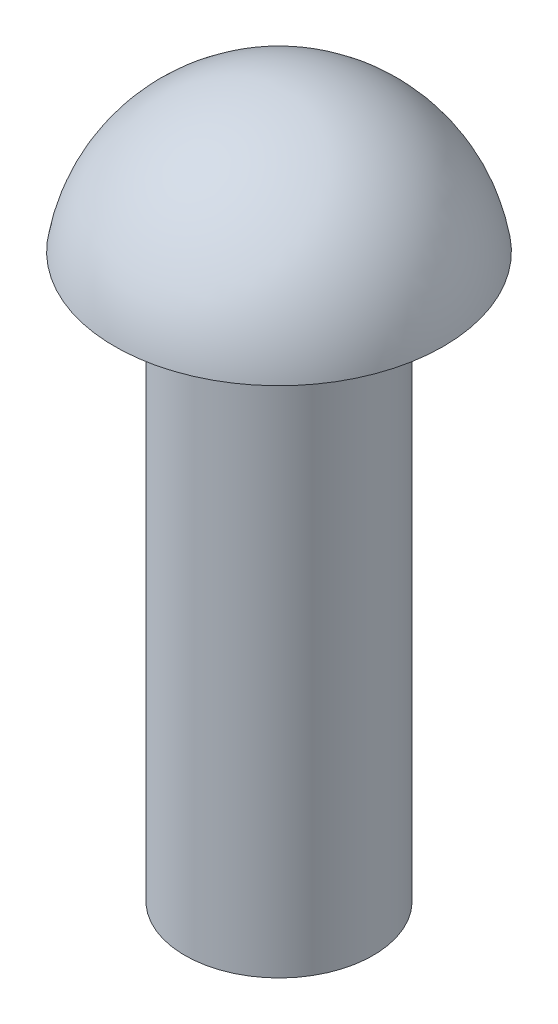
ISO-10303-21;
HEADER;
FILE_DESCRIPTION(('STEP AP214'),'2;1');
FILE_NAME('part.step','',(''),(''),'','','');
FILE_SCHEMA(('AUTOMOTIVE_DESIGN { 1 0 10303 214 1 1 1 1 }'));
ENDSEC;
DATA;
#1=APPLICATION_CONTEXT('core data for automotive mechanical design processes');
#2=APPLICATION_PROTOCOL_DEFINITION('international standard','automotive_design',2000,#1);
#3=PRODUCT_CONTEXT('',#1,'mechanical');
#4=PRODUCT('Part','Part','',(#3));
#5=PRODUCT_RELATED_PRODUCT_CATEGORY('part','',(#4));
#6=PRODUCT_DEFINITION_FORMATION('','',#4);
#7=PRODUCT_DEFINITION_CONTEXT('part definition',#1,'design');
#8=PRODUCT_DEFINITION('design','',#6,#7);
#9=PRODUCT_DEFINITION_SHAPE('','',#8);
#10=(LENGTH_UNIT() NAMED_UNIT(*) SI_UNIT(.MILLI.,.METRE.));
#11=(NAMED_UNIT(*) PLANE_ANGLE_UNIT() SI_UNIT($,.RADIAN.));
#12=(NAMED_UNIT(*) SI_UNIT($,.STERADIAN.) SOLID_ANGLE_UNIT());
#13=UNCERTAINTY_MEASURE_WITH_UNIT(LENGTH_MEASURE(1.E-05),#10,'distance_accuracy_value','');
#14=(GEOMETRIC_REPRESENTATION_CONTEXT(3) GLOBAL_UNCERTAINTY_ASSIGNED_CONTEXT((#13)) GLOBAL_UNIT_ASSIGNED_CONTEXT((#10,
#11,#12)) REPRESENTATION_CONTEXT('',''));
#15=CARTESIAN_POINT('',(0.,0.,0.));
#16=DIRECTION('',(0.,0.,1.));
#17=DIRECTION('',(1.,0.,0.));
#18=AXIS2_PLACEMENT_3D('',#15,#16,#17);
#19=CARTESIAN_POINT('',(0.,0.,0.));
#20=DIRECTION('',(0.,1.,0.));
#21=DIRECTION('',(-1.,0.,0.));
#22=AXIS2_PLACEMENT_3D('',#19,#20,#21);
#23=PLANE('',#22);
#24=CARTESIAN_POINT('',(0.,0.,0.));
#25=DIRECTION('',(0.,1.,0.));
#26=DIRECTION('',(-1.,0.,0.));
#27=AXIS2_PLACEMENT_3D('',#24,#25,#26);
#28=CIRCLE('',#27,4.3688);
#29=CARTESIAN_POINT('',(-4.3688,0.,0.));
#30=VERTEX_POINT('',#29);
#31=EDGE_CURVE('E10',#30,#30,#28,.T.);
#32=ORIENTED_EDGE('',*,*,#31,.F.);
#33=EDGE_LOOP('',(#32));
#34=FACE_BOUND('',#33,.T.);
#35=ADVANCED_FACE('F41',(#34),#23,.F.);
#36=CARTESIAN_POINT('',(0.,32.639,0.));
#37=DIRECTION('',(0.,1.,0.));
#38=DIRECTION('',(-1.,0.,0.));
#39=AXIS2_PLACEMENT_3D('',#36,#37,#38);
#40=CYLINDRICAL_SURFACE('',#39,4.3688);
#41=CARTESIAN_POINT('',(0.,26.1112,0.));
#42=DIRECTION('',(0.,1.,0.));
#43=DIRECTION('',(-1.,0.,0.));
#44=AXIS2_PLACEMENT_3D('',#41,#42,#43);
#45=CIRCLE('',#44,4.3688);
#46=CARTESIAN_POINT('',(-4.3688,26.1112,0.));
#47=VERTEX_POINT('',#46);
#48=EDGE_CURVE('E48',#47,#47,#45,.T.);
#49=ORIENTED_EDGE('',*,*,#48,.F.);
#50=EDGE_LOOP('',(#49));
#51=FACE_BOUND('',#50,.T.);
#52=ORIENTED_EDGE('',*,*,#31,.T.);
#53=EDGE_LOOP('',(#52));
#54=FACE_BOUND('',#53,.T.);
#55=ADVANCED_FACE('F65',(#51,#54),#40,.T.);
#56=CARTESIAN_POINT('',(4.3688,26.1112,0.));
#57=DIRECTION('',(0.,1.,0.));
#58=DIRECTION('',(-1.,0.,0.));
#59=AXIS2_PLACEMENT_3D('',#56,#57,#58);
#60=PLANE('',#59);
#61=CARTESIAN_POINT('',(0.,26.1112,0.));
#62=DIRECTION('',(0.,1.,0.));
#63=DIRECTION('',(-1.,0.,0.));
#64=AXIS2_PLACEMENT_3D('',#61,#62,#63);
#65=CIRCLE('',#64,7.62875796706122);
#66=CARTESIAN_POINT('',(-7.62875796706122,26.1112,0.));
#67=VERTEX_POINT('',#66);
#68=EDGE_CURVE('E53',#67,#67,#65,.T.);
#69=ORIENTED_EDGE('',*,*,#68,.F.);
#70=EDGE_LOOP('',(#69));
#71=FACE_BOUND('',#70,.T.);
#72=ORIENTED_EDGE('',*,*,#48,.T.);
#73=EDGE_LOOP('',(#72));
#74=FACE_BOUND('',#73,.T.);
#75=ADVANCED_FACE('F63',(#71,#74),#60,.F.);
#76=CARTESIAN_POINT('',(0.,24.9174,0.));
#77=DIRECTION('',(0.,1.,0.));
#78=DIRECTION('',(1.,0.,0.));
#79=AXIS2_PLACEMENT_3D('',#76,#77,#78);
#80=SPHERICAL_SURFACE('',#79,7.7216);
#81=ORIENTED_EDGE('',*,*,#68,.T.);
#82=EDGE_LOOP('',(#81));
#83=FACE_BOUND('',#82,.T.);
#84=ADVANCED_FACE('F61',(#83),#80,.T.);
#85=CLOSED_SHELL('',(#35,#55,#75,#84));
#86=MANIFOLD_SOLID_BREP('B2',#85);
#87=ADVANCED_BREP_SHAPE_REPRESENTATION('',(#18,#86),#14);
#88=SHAPE_DEFINITION_REPRESENTATION(#9,#87);
ENDSEC;
END-ISO-10303-21;
